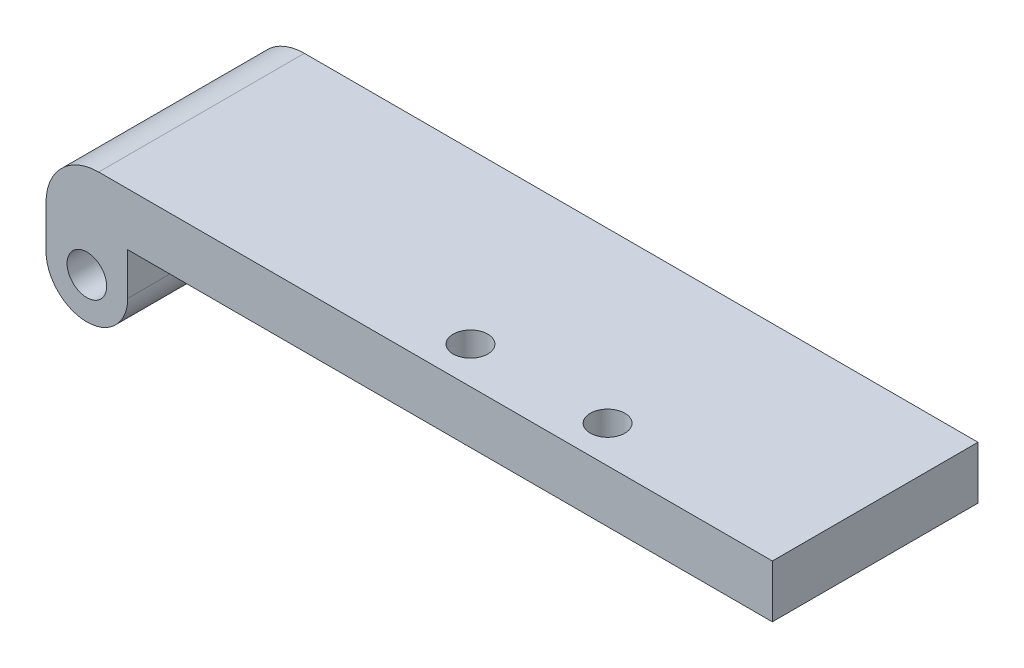
ISO-10303-21;
HEADER;
FILE_DESCRIPTION(('STEP AP214'),'2;1');
FILE_NAME('part.step','',(''),(''),'','','');
FILE_SCHEMA(('AUTOMOTIVE_DESIGN { 1 0 10303 214 1 1 1 1 }'));
ENDSEC;
DATA;
#1=APPLICATION_CONTEXT('core data for automotive mechanical design processes');
#2=APPLICATION_PROTOCOL_DEFINITION('international standard','automotive_design',2000,#1);
#3=PRODUCT_CONTEXT('',#1,'mechanical');
#4=PRODUCT('Part','Part','',(#3));
#5=PRODUCT_RELATED_PRODUCT_CATEGORY('part','',(#4));
#6=PRODUCT_DEFINITION_FORMATION('','',#4);
#7=PRODUCT_DEFINITION_CONTEXT('part definition',#1,'design');
#8=PRODUCT_DEFINITION('design','',#6,#7);
#9=PRODUCT_DEFINITION_SHAPE('','',#8);
#10=(LENGTH_UNIT() NAMED_UNIT(*) SI_UNIT(.MILLI.,.METRE.));
#11=(NAMED_UNIT(*) PLANE_ANGLE_UNIT() SI_UNIT($,.RADIAN.));
#12=(NAMED_UNIT(*) SI_UNIT($,.STERADIAN.) SOLID_ANGLE_UNIT());
#13=UNCERTAINTY_MEASURE_WITH_UNIT(LENGTH_MEASURE(1.E-05),#10,'distance_accuracy_value','');
#14=(GEOMETRIC_REPRESENTATION_CONTEXT(3) GLOBAL_UNCERTAINTY_ASSIGNED_CONTEXT((#13)) GLOBAL_UNIT_ASSIGNED_CONTEXT((#10,
#11,#12)) REPRESENTATION_CONTEXT('',''));
#15=CARTESIAN_POINT('',(0.,0.,0.));
#16=DIRECTION('',(0.,0.,1.));
#17=DIRECTION('',(1.,0.,0.));
#18=AXIS2_PLACEMENT_3D('',#15,#16,#17);
#19=CARTESIAN_POINT('',(-31.035625,3.175,24.765));
#20=DIRECTION('',(0.,1.,0.));
#21=DIRECTION('',(0.,0.,1.));
#22=AXIS2_PLACEMENT_3D('',#19,#20,#21);
#23=PLANE('',#22);
#24=DIRECTION('',(-1.,0.,0.));
#25=VECTOR('',#24,1.);
#26=CARTESIAN_POINT('',(50.0856250000001,3.175,24.765));
#27=LINE('',#26,#25);
#28=CARTESIAN_POINT('',(50.085625,3.175,24.765));
#29=VERTEX_POINT('',#28);
#30=CARTESIAN_POINT('',(-31.035625,3.175,24.765));
#31=VERTEX_POINT('',#30);
#32=EDGE_CURVE('E53',#29,#31,#27,.T.);
#33=ORIENTED_EDGE('',*,*,#32,.F.);
#34=DIRECTION('',(0.,0.,1.));
#35=VECTOR('',#34,1.);
#36=CARTESIAN_POINT('',(50.085625,3.175,0.));
#37=LINE('',#36,#35);
#38=CARTESIAN_POINT('',(50.085625,3.175,0.));
#39=VERTEX_POINT('',#38);
#40=EDGE_CURVE('E110',#39,#29,#37,.T.);
#41=ORIENTED_EDGE('',*,*,#40,.F.);
#42=DIRECTION('',(-1.,0.,0.));
#43=VECTOR('',#42,1.);
#44=CARTESIAN_POINT('',(-37.385625,3.175,0.));
#45=LINE('',#44,#43);
#46=CARTESIAN_POINT('',(-31.035625,3.175,0.));
#47=VERTEX_POINT('',#46);
#48=EDGE_CURVE('E97',#39,#47,#45,.T.);
#49=ORIENTED_EDGE('',*,*,#48,.T.);
#50=DIRECTION('',(0.,0.,-1.));
#51=VECTOR('',#50,1.);
#52=CARTESIAN_POINT('',(-31.035625,3.175,38.1));
#53=LINE('',#52,#51);
#54=EDGE_CURVE('E106',#47,#31,#53,.F.);
#55=ORIENTED_EDGE('',*,*,#54,.T.);
#56=EDGE_LOOP('',(#33,#41,#49,#55));
#57=FACE_BOUND('',#56,.T.);
#58=CARTESIAN_POINT('',(25.7968750000001,3.175,20.32));
#59=DIRECTION('',(0.,1.,0.));
#60=DIRECTION('',(0.,0.,1.));
#61=AXIS2_PLACEMENT_3D('',#58,#59,#60);
#62=CIRCLE('',#61,2.0828);
#63=CARTESIAN_POINT('',(25.7968750000001,3.175,22.4028));
#64=VERTEX_POINT('',#63);
#65=EDGE_CURVE('E39',#64,#64,#62,.F.);
#66=ORIENTED_EDGE('',*,*,#65,.T.);
#67=EDGE_LOOP('',(#66));
#68=FACE_BOUND('',#67,.T.);
#69=CARTESIAN_POINT('',(9.286875,3.175,20.32));
#70=DIRECTION('',(0.,1.,0.));
#71=DIRECTION('',(0.,0.,1.));
#72=AXIS2_PLACEMENT_3D('',#69,#70,#71);
#73=CIRCLE('',#72,2.0828);
#74=CARTESIAN_POINT('',(9.286875,3.175,22.4028));
#75=VERTEX_POINT('',#74);
#76=EDGE_CURVE('E115',#75,#75,#73,.F.);
#77=ORIENTED_EDGE('',*,*,#76,.T.);
#78=EDGE_LOOP('',(#77));
#79=FACE_BOUND('',#78,.T.);
#80=ADVANCED_FACE('F35',(#57,#68,#79),#23,.T.);
#81=CARTESIAN_POINT('',(-32.464375,-8.255,0.));
#82=DIRECTION('',(0.,0.,1.));
#83=DIRECTION('',(1.,0.,0.));
#84=AXIS2_PLACEMENT_3D('',#81,#82,#83);
#85=PLANE('',#84);
#86=DIRECTION('',(0.,-1.,0.));
#87=VECTOR('',#86,1.);
#88=CARTESIAN_POINT('',(-37.385625,-8.255,0.));
#89=LINE('',#88,#87);
#90=CARTESIAN_POINT('',(-37.385625,-3.175,0.));
#91=VERTEX_POINT('',#90);
#92=CARTESIAN_POINT('',(-37.385625,-8.255,0.));
#93=VERTEX_POINT('',#92);
#94=EDGE_CURVE('E101',#91,#93,#89,.T.);
#95=ORIENTED_EDGE('',*,*,#94,.F.);
#96=CARTESIAN_POINT('',(-31.035625,-3.175,0.));
#97=DIRECTION('',(0.,0.,1.));
#98=DIRECTION('',(1.,0.,0.));
#99=AXIS2_PLACEMENT_3D('',#96,#97,#98);
#100=CIRCLE('',#99,6.35);
#101=EDGE_CURVE('E92',#91,#47,#100,.F.);
#102=ORIENTED_EDGE('',*,*,#101,.T.);
#103=ORIENTED_EDGE('',*,*,#48,.F.);
#104=DIRECTION('',(0.,1.,0.));
#105=VECTOR('',#104,1.);
#106=CARTESIAN_POINT('',(50.085625,-3.175,0.));
#107=LINE('',#106,#105);
#108=CARTESIAN_POINT('',(50.085625,-3.175,0.));
#109=VERTEX_POINT('',#108);
#110=EDGE_CURVE('E139',#109,#39,#107,.T.);
#111=ORIENTED_EDGE('',*,*,#110,.F.);
#112=DIRECTION('',(1.,0.,0.));
#113=VECTOR('',#112,1.);
#114=CARTESIAN_POINT('',(-27.543125,-3.175,0.));
#115=LINE('',#114,#113);
#116=CARTESIAN_POINT('',(-27.543125,-3.175,0.));
#117=VERTEX_POINT('',#116);
#118=EDGE_CURVE('E126',#117,#109,#115,.T.);
#119=ORIENTED_EDGE('',*,*,#118,.F.);
#120=DIRECTION('',(0.,1.,0.));
#121=VECTOR('',#120,1.);
#122=CARTESIAN_POINT('',(-27.543125,-8.255,0.));
#123=LINE('',#122,#121);
#124=CARTESIAN_POINT('',(-27.543125,-8.255,0.));
#125=VERTEX_POINT('',#124);
#126=EDGE_CURVE('E129',#125,#117,#123,.T.);
#127=ORIENTED_EDGE('',*,*,#126,.F.);
#128=CARTESIAN_POINT('',(-32.464375,-8.255,0.));
#129=DIRECTION('',(0.,0.,1.));
#130=DIRECTION('',(1.,0.,0.));
#131=AXIS2_PLACEMENT_3D('',#128,#129,#130);
#132=CIRCLE('',#131,4.92125);
#133=EDGE_CURVE('E132',#93,#125,#132,.T.);
#134=ORIENTED_EDGE('',*,*,#133,.F.);
#135=EDGE_LOOP('',(#95,#102,#103,#111,#119,#127,#134));
#136=FACE_BOUND('',#135,.T.);
#137=CARTESIAN_POINT('',(-32.464375,-8.255,0.));
#138=DIRECTION('',(0.,0.,1.));
#139=DIRECTION('',(1.,0.,0.));
#140=AXIS2_PLACEMENT_3D('',#137,#138,#139);
#141=CIRCLE('',#140,2.38125);
#142=CARTESIAN_POINT('',(-34.845625,-8.255,0.));
#143=VERTEX_POINT('',#142);
#144=EDGE_CURVE('E111',#143,#143,#141,.T.);
#145=ORIENTED_EDGE('',*,*,#144,.T.);
#146=EDGE_LOOP('',(#145));
#147=FACE_BOUND('',#146,.T.);
#148=ADVANCED_FACE('F94',(#136,#147),#85,.F.);
#149=CARTESIAN_POINT('',(50.085625,0.,0.));
#150=DIRECTION('',(1.,0.,0.));
#151=DIRECTION('',(0.,0.,-1.));
#152=AXIS2_PLACEMENT_3D('',#149,#150,#151);
#153=PLANE('',#152);
#154=DIRECTION('',(0.,1.,0.));
#155=VECTOR('',#154,1.);
#156=CARTESIAN_POINT('',(50.085625,3.175,24.765));
#157=LINE('',#156,#155);
#158=CARTESIAN_POINT('',(50.085625,-3.175,24.765));
#159=VERTEX_POINT('',#158);
#160=EDGE_CURVE('E159',#159,#29,#157,.T.);
#161=ORIENTED_EDGE('',*,*,#160,.F.);
#162=DIRECTION('',(0.,0.,-1.));
#163=VECTOR('',#162,1.);
#164=CARTESIAN_POINT('',(50.085625,-3.175,38.1));
#165=LINE('',#164,#163);
#166=EDGE_CURVE('E141',#159,#109,#165,.T.);
#167=ORIENTED_EDGE('',*,*,#166,.T.);
#168=ORIENTED_EDGE('',*,*,#110,.T.);
#169=ORIENTED_EDGE('',*,*,#40,.T.);
#170=EDGE_LOOP('',(#161,#167,#168,#169));
#171=FACE_BOUND('',#170,.T.);
#172=ADVANCED_FACE('F167',(#171),#153,.T.);
#173=CARTESIAN_POINT('',(-27.543125,-3.175,38.1));
#174=DIRECTION('',(0.,1.,0.));
#175=DIRECTION('',(-1.,0.,0.));
#176=AXIS2_PLACEMENT_3D('',#173,#174,#175);
#177=PLANE('',#176);
#178=CARTESIAN_POINT('',(9.286875,-3.175,20.32));
#179=DIRECTION('',(0.,1.,0.));
#180=DIRECTION('',(-1.,0.,0.));
#181=AXIS2_PLACEMENT_3D('',#178,#179,#180);
#182=CIRCLE('',#181,2.0828);
#183=CARTESIAN_POINT('',(7.204075,-3.175,20.32));
#184=VERTEX_POINT('',#183);
#185=EDGE_CURVE('E146',#184,#184,#182,.T.);
#186=ORIENTED_EDGE('',*,*,#185,.T.);
#187=EDGE_LOOP('',(#186));
#188=FACE_BOUND('',#187,.T.);
#189=CARTESIAN_POINT('',(25.7968750000001,-3.175,20.32));
#190=DIRECTION('',(0.,1.,0.));
#191=DIRECTION('',(-1.,0.,0.));
#192=AXIS2_PLACEMENT_3D('',#189,#190,#191);
#193=CIRCLE('',#192,2.0828);
#194=CARTESIAN_POINT('',(23.7140750000001,-3.175,20.32));
#195=VERTEX_POINT('',#194);
#196=EDGE_CURVE('E143',#195,#195,#193,.T.);
#197=ORIENTED_EDGE('',*,*,#196,.T.);
#198=EDGE_LOOP('',(#197));
#199=FACE_BOUND('',#198,.T.);
#200=ORIENTED_EDGE('',*,*,#166,.F.);
#201=DIRECTION('',(1.,0.,0.));
#202=VECTOR('',#201,1.);
#203=CARTESIAN_POINT('',(-27.5431249999999,-3.175,24.765));
#204=LINE('',#203,#202);
#205=CARTESIAN_POINT('',(-27.543125,-3.175,24.765));
#206=VERTEX_POINT('',#205);
#207=EDGE_CURVE('E157',#206,#159,#204,.T.);
#208=ORIENTED_EDGE('',*,*,#207,.F.);
#209=DIRECTION('',(0.,0.,-1.));
#210=VECTOR('',#209,1.);
#211=CARTESIAN_POINT('',(-27.543125,-3.175,38.1));
#212=LINE('',#211,#210);
#213=EDGE_CURVE('E124',#206,#117,#212,.T.);
#214=ORIENTED_EDGE('',*,*,#213,.T.);
#215=ORIENTED_EDGE('',*,*,#118,.T.);
#216=EDGE_LOOP('',(#200,#208,#214,#215));
#217=FACE_BOUND('',#216,.T.);
#218=ADVANCED_FACE('F171',(#188,#199,#217),#177,.F.);
#219=CARTESIAN_POINT('',(25.7968750000001,-13.17625,20.32));
#220=DIRECTION('',(0.,1.,0.));
#221=DIRECTION('',(0.,0.,1.));
#222=AXIS2_PLACEMENT_3D('',#219,#220,#221);
#223=CYLINDRICAL_SURFACE('',#222,2.0828);
#224=ORIENTED_EDGE('',*,*,#196,.F.);
#225=EDGE_LOOP('',(#224));
#226=FACE_BOUND('',#225,.T.);
#227=ORIENTED_EDGE('',*,*,#65,.F.);
#228=EDGE_LOOP('',(#227));
#229=FACE_BOUND('',#228,.T.);
#230=ADVANCED_FACE('F206',(#226,#229),#223,.F.);
#231=CARTESIAN_POINT('',(9.286875,-13.17625,20.32));
#232=DIRECTION('',(0.,1.,0.));
#233=DIRECTION('',(0.,0.,1.));
#234=AXIS2_PLACEMENT_3D('',#231,#232,#233);
#235=CYLINDRICAL_SURFACE('',#234,2.0828);
#236=ORIENTED_EDGE('',*,*,#185,.F.);
#237=EDGE_LOOP('',(#236));
#238=FACE_BOUND('',#237,.T.);
#239=ORIENTED_EDGE('',*,*,#76,.F.);
#240=EDGE_LOOP('',(#239));
#241=FACE_BOUND('',#240,.T.);
#242=ADVANCED_FACE('F208',(#238,#241),#235,.F.);
#243=CARTESIAN_POINT('',(-27.543125,-8.255,38.1));
#244=DIRECTION('',(-1.,0.,0.));
#245=DIRECTION('',(0.,0.,1.));
#246=AXIS2_PLACEMENT_3D('',#243,#244,#245);
#247=PLANE('',#246);
#248=ORIENTED_EDGE('',*,*,#213,.F.);
#249=DIRECTION('',(0.,1.,0.));
#250=VECTOR('',#249,1.);
#251=CARTESIAN_POINT('',(-27.543125,-8.255,24.765));
#252=LINE('',#251,#250);
#253=CARTESIAN_POINT('',(-27.543125,-8.255,24.765));
#254=VERTEX_POINT('',#253);
#255=EDGE_CURVE('E155',#254,#206,#252,.T.);
#256=ORIENTED_EDGE('',*,*,#255,.F.);
#257=DIRECTION('',(0.,0.,-1.));
#258=VECTOR('',#257,1.);
#259=CARTESIAN_POINT('',(-27.543125,-8.255,38.1));
#260=LINE('',#259,#258);
#261=EDGE_CURVE('E122',#254,#125,#260,.T.);
#262=ORIENTED_EDGE('',*,*,#261,.T.);
#263=ORIENTED_EDGE('',*,*,#126,.T.);
#264=EDGE_LOOP('',(#248,#256,#262,#263));
#265=FACE_BOUND('',#264,.T.);
#266=ADVANCED_FACE('F175',(#265),#247,.F.);
#267=CARTESIAN_POINT('',(-32.464375,-8.255,38.1));
#268=DIRECTION('',(0.,0.,-1.));
#269=DIRECTION('',(-1.,0.,0.));
#270=AXIS2_PLACEMENT_3D('',#267,#268,#269);
#271=CYLINDRICAL_SURFACE('',#270,4.92125);
#272=ORIENTED_EDGE('',*,*,#261,.F.);
#273=CARTESIAN_POINT('',(-32.464375,-8.255,24.765));
#274=DIRECTION('',(0.,0.,-1.));
#275=DIRECTION('',(-1.,0.,0.));
#276=AXIS2_PLACEMENT_3D('',#273,#274,#275);
#277=CIRCLE('',#276,4.92125);
#278=CARTESIAN_POINT('',(-37.385625,-8.255,24.765));
#279=VERTEX_POINT('',#278);
#280=EDGE_CURVE('E153',#279,#254,#277,.F.);
#281=ORIENTED_EDGE('',*,*,#280,.F.);
#282=DIRECTION('',(0.,0.,-1.));
#283=VECTOR('',#282,1.);
#284=CARTESIAN_POINT('',(-37.385625,-8.255,38.1));
#285=LINE('',#284,#283);
#286=EDGE_CURVE('E120',#279,#93,#285,.T.);
#287=ORIENTED_EDGE('',*,*,#286,.T.);
#288=ORIENTED_EDGE('',*,*,#133,.T.);
#289=EDGE_LOOP('',(#272,#281,#287,#288));
#290=FACE_BOUND('',#289,.T.);
#291=ADVANCED_FACE('F179',(#290),#271,.T.);
#292=CARTESIAN_POINT('',(-37.385625,-8.255,38.1));
#293=DIRECTION('',(1.,0.,0.));
#294=DIRECTION('',(0.,0.,-1.));
#295=AXIS2_PLACEMENT_3D('',#292,#293,#294);
#296=PLANE('',#295);
#297=ORIENTED_EDGE('',*,*,#286,.F.);
#298=DIRECTION('',(0.,-1.,0.));
#299=VECTOR('',#298,1.);
#300=CARTESIAN_POINT('',(-37.385625,-3.175,24.765));
#301=LINE('',#300,#299);
#302=CARTESIAN_POINT('',(-37.385625,-3.175,24.765));
#303=VERTEX_POINT('',#302);
#304=EDGE_CURVE('E45',#303,#279,#301,.T.);
#305=ORIENTED_EDGE('',*,*,#304,.F.);
#306=DIRECTION('',(0.,0.,-1.));
#307=VECTOR('',#306,1.);
#308=CARTESIAN_POINT('',(-37.385625,-3.175,38.1));
#309=LINE('',#308,#307);
#310=EDGE_CURVE('E105',#303,#91,#309,.T.);
#311=ORIENTED_EDGE('',*,*,#310,.T.);
#312=ORIENTED_EDGE('',*,*,#94,.T.);
#313=EDGE_LOOP('',(#297,#305,#311,#312));
#314=FACE_BOUND('',#313,.T.);
#315=ADVANCED_FACE('F182',(#314),#296,.F.);
#316=CARTESIAN_POINT('',(-31.035625,-3.175,38.1));
#317=DIRECTION('',(0.,0.,-1.));
#318=DIRECTION('',(-1.,0.,0.));
#319=AXIS2_PLACEMENT_3D('',#316,#317,#318);
#320=CYLINDRICAL_SURFACE('',#319,6.35);
#321=CARTESIAN_POINT('',(-31.035625,-3.175,24.765));
#322=DIRECTION('',(0.,0.,-1.));
#323=DIRECTION('',(-1.,0.,0.));
#324=AXIS2_PLACEMENT_3D('',#321,#322,#323);
#325=CIRCLE('',#324,6.35);
#326=EDGE_CURVE('E11',#31,#303,#325,.F.);
#327=ORIENTED_EDGE('',*,*,#326,.F.);
#328=ORIENTED_EDGE('',*,*,#54,.F.);
#329=ORIENTED_EDGE('',*,*,#101,.F.);
#330=ORIENTED_EDGE('',*,*,#310,.F.);
#331=EDGE_LOOP('',(#327,#328,#329,#330));
#332=FACE_BOUND('',#331,.T.);
#333=ADVANCED_FACE('F114',(#332),#320,.T.);
#334=CARTESIAN_POINT('',(-32.464375,-8.255,38.1));
#335=DIRECTION('',(0.,0.,-1.));
#336=DIRECTION('',(-1.,0.,0.));
#337=AXIS2_PLACEMENT_3D('',#334,#335,#336);
#338=CYLINDRICAL_SURFACE('',#337,2.38125);
#339=CARTESIAN_POINT('',(-32.464375,-8.255,24.765));
#340=DIRECTION('',(0.,0.,-1.));
#341=DIRECTION('',(-1.,0.,0.));
#342=AXIS2_PLACEMENT_3D('',#339,#340,#341);
#343=CIRCLE('',#342,2.38125);
#344=CARTESIAN_POINT('',(-34.845625,-8.255,24.765));
#345=VERTEX_POINT('',#344);
#346=EDGE_CURVE('E149',#345,#345,#343,.T.);
#347=CARTESIAN_POINT('',(-34.845625,-8.255,24.765));
#348=CARTESIAN_POINT('',(-34.845625,-8.255,24.50703125));
#349=CARTESIAN_POINT('',(-34.845625,-8.255,24.2490625));
#350=CARTESIAN_POINT('',(-34.845625,-8.255,23.733125));
#351=CARTESIAN_POINT('',(-34.845625,-8.255,23.47515625));
#352=CARTESIAN_POINT('',(-34.845625,-8.255,22.95921875));
#353=CARTESIAN_POINT('',(-34.845625,-8.255,22.70125));
#354=CARTESIAN_POINT('',(-34.845625,-8.255,22.1853125));
#355=CARTESIAN_POINT('',(-34.845625,-8.255,21.92734375));
#356=CARTESIAN_POINT('',(-34.845625,-8.255,21.41140625));
#357=CARTESIAN_POINT('',(-34.845625,-8.255,21.1534375));
#358=CARTESIAN_POINT('',(-34.845625,-8.255,20.6375));
#359=CARTESIAN_POINT('',(-34.845625,-8.255,20.37953125));
#360=CARTESIAN_POINT('',(-34.845625,-8.255,19.86359375));
#361=CARTESIAN_POINT('',(-34.845625,-8.255,19.605625));
#362=CARTESIAN_POINT('',(-34.845625,-8.255,19.0896875));
#363=CARTESIAN_POINT('',(-34.845625,-8.255,18.83171875));
#364=CARTESIAN_POINT('',(-34.845625,-8.255,18.31578125));
#365=CARTESIAN_POINT('',(-34.845625,-8.255,18.0578125));
#366=CARTESIAN_POINT('',(-34.845625,-8.255,17.541875));
#367=CARTESIAN_POINT('',(-34.845625,-8.255,17.28390625));
#368=CARTESIAN_POINT('',(-34.845625,-8.255,16.76796875));
#369=CARTESIAN_POINT('',(-34.845625,-8.255,16.51));
#370=CARTESIAN_POINT('',(-34.845625,-8.255,15.9940625));
#371=CARTESIAN_POINT('',(-34.845625,-8.255,15.73609375));
#372=CARTESIAN_POINT('',(-34.845625,-8.255,15.22015625));
#373=CARTESIAN_POINT('',(-34.845625,-8.255,14.9621875));
#374=CARTESIAN_POINT('',(-34.845625,-8.255,14.44625));
#375=CARTESIAN_POINT('',(-34.845625,-8.255,14.18828125));
#376=CARTESIAN_POINT('',(-34.845625,-8.255,13.67234375));
#377=CARTESIAN_POINT('',(-34.845625,-8.255,13.414375));
#378=CARTESIAN_POINT('',(-34.845625,-8.255,12.8984375));
#379=CARTESIAN_POINT('',(-34.845625,-8.255,12.64046875));
#380=CARTESIAN_POINT('',(-34.845625,-8.255,12.12453125));
#381=CARTESIAN_POINT('',(-34.845625,-8.255,11.8665625));
#382=CARTESIAN_POINT('',(-34.845625,-8.255,11.350625));
#383=CARTESIAN_POINT('',(-34.845625,-8.255,11.09265625));
#384=CARTESIAN_POINT('',(-34.845625,-8.255,10.57671875));
#385=CARTESIAN_POINT('',(-34.845625,-8.255,10.31875));
#386=CARTESIAN_POINT('',(-34.845625,-8.255,9.80281250000001));
#387=CARTESIAN_POINT('',(-34.845625,-8.255,9.54484375000001));
#388=CARTESIAN_POINT('',(-34.845625,-8.255,9.02890625000001));
#389=CARTESIAN_POINT('',(-34.845625,-8.255,8.77093750000001));
#390=CARTESIAN_POINT('',(-34.845625,-8.255,8.25500000000001));
#391=CARTESIAN_POINT('',(-34.845625,-8.255,7.99703125000001));
#392=CARTESIAN_POINT('',(-34.845625,-8.255,7.48109375000001));
#393=CARTESIAN_POINT('',(-34.845625,-8.255,7.22312500000001));
#394=CARTESIAN_POINT('',(-34.845625,-8.255,6.70718750000001));
#395=CARTESIAN_POINT('',(-34.845625,-8.255,6.44921875000001));
#396=CARTESIAN_POINT('',(-34.845625,-8.255,5.93328125000001));
#397=CARTESIAN_POINT('',(-34.845625,-8.255,5.67531250000001));
#398=CARTESIAN_POINT('',(-34.845625,-8.255,5.15937500000001));
#399=CARTESIAN_POINT('',(-34.845625,-8.255,4.90140625000001));
#400=CARTESIAN_POINT('',(-34.845625,-8.255,4.38546875000001));
#401=CARTESIAN_POINT('',(-34.845625,-8.255,4.1275));
#402=CARTESIAN_POINT('',(-34.845625,-8.255,3.6115625));
#403=CARTESIAN_POINT('',(-34.845625,-8.255,3.35359375));
#404=CARTESIAN_POINT('',(-34.845625,-8.255,2.83765625000001));
#405=CARTESIAN_POINT('',(-34.845625,-8.255,2.57968750000001));
#406=CARTESIAN_POINT('',(-34.845625,-8.255,2.06375000000001));
#407=CARTESIAN_POINT('',(-34.845625,-8.255,1.80578125));
#408=CARTESIAN_POINT('',(-34.845625,-8.255,1.28984375));
#409=CARTESIAN_POINT('',(-34.845625,-8.255,1.031875));
#410=CARTESIAN_POINT('',(-34.845625,-8.255,0.515937499999998));
#411=CARTESIAN_POINT('',(-34.845625,-8.255,0.257968749999999));
#412=CARTESIAN_POINT('',(-34.845625,-8.255,0.));
#413=B_SPLINE_CURVE_WITH_KNOTS('',3,(#347,#348,#349,#350,#351,#352,#353,#354,#355,#356,#357,
#358,#359,#360,#361,#362,#363,#364,#365,#366,#367,#368,#369,#370,#371,#372,#373,#374,#375,#376,
#377,#378,#379,#380,#381,#382,#383,#384,#385,#386,#387,#388,#389,#390,#391,#392,#393,#394,#395,
#396,#397,#398,#399,#400,#401,#402,#403,#404,#405,#406,#407,#408,#409,#410,#411,#412),
.UNSPECIFIED.,.F.,.F.,(4,2,2,2,2,2,2,2,2,2,2,2,2,2,2,2,2,2,2,2,2,2,2,2,2,2,2,2,2,2,2,2,4),(0.,
0.773906250000005,1.5478125,2.32171875,3.095625,3.86953125000001,4.64343750000001,
5.41734375000001,6.19125000000001,6.96515625000001,7.73906250000001,8.51296875000001,
9.28687500000001,10.06078125,10.8346875,11.60859375,12.3825,13.15640625,13.9303125,14.70421875,
15.478125,16.25203125,17.0259375,17.79984375,18.57375,19.34765625,20.1215625,20.89546875,
21.669375,22.44328125,23.2171875,23.99109375,24.765),.UNSPECIFIED.);
#414=EDGE_CURVE('BSEAM189',#345,#143,#413,.T.);
#415=ORIENTED_EDGE('',*,*,#346,.F.);
#416=ORIENTED_EDGE('',*,*,#144,.F.);
#417=ORIENTED_EDGE('',*,*,#414,.T.);
#418=ORIENTED_EDGE('',*,*,#414,.F.);
#419=EDGE_LOOP('',(#415,#417,#416,#418));
#420=FACE_BOUND('',#419,.T.);
#421=ADVANCED_FACE('F189',(#420),#338,.F.);
#422=CARTESIAN_POINT('',(21.351875,34.925,24.765));
#423=DIRECTION('',(0.,0.,-1.));
#424=DIRECTION('',(-1.,0.,0.));
#425=AXIS2_PLACEMENT_3D('',#422,#423,#424);
#426=PLANE('',#425);
#427=ORIENTED_EDGE('',*,*,#346,.T.);
#428=EDGE_LOOP('',(#427));
#429=FACE_BOUND('',#428,.T.);
#430=ORIENTED_EDGE('',*,*,#160,.T.);
#431=ORIENTED_EDGE('',*,*,#32,.T.);
#432=ORIENTED_EDGE('',*,*,#326,.T.);
#433=ORIENTED_EDGE('',*,*,#304,.T.);
#434=ORIENTED_EDGE('',*,*,#280,.T.);
#435=ORIENTED_EDGE('',*,*,#255,.T.);
#436=ORIENTED_EDGE('',*,*,#207,.T.);
#437=EDGE_LOOP('',(#430,#431,#432,#433,#434,#435,#436));
#438=FACE_BOUND('',#437,.T.);
#439=ADVANCED_FACE('F37',(#429,#438),#426,.F.);
#440=CLOSED_SHELL('',(#80,#148,#172,#218,#230,#242,#266,#291,#315,#333,#421,#439));
#441=MANIFOLD_SOLID_BREP('B2',#440);
#442=ADVANCED_BREP_SHAPE_REPRESENTATION('',(#18,#441),#14);
#443=SHAPE_DEFINITION_REPRESENTATION(#9,#442);
ENDSEC;
END-ISO-10303-21;
